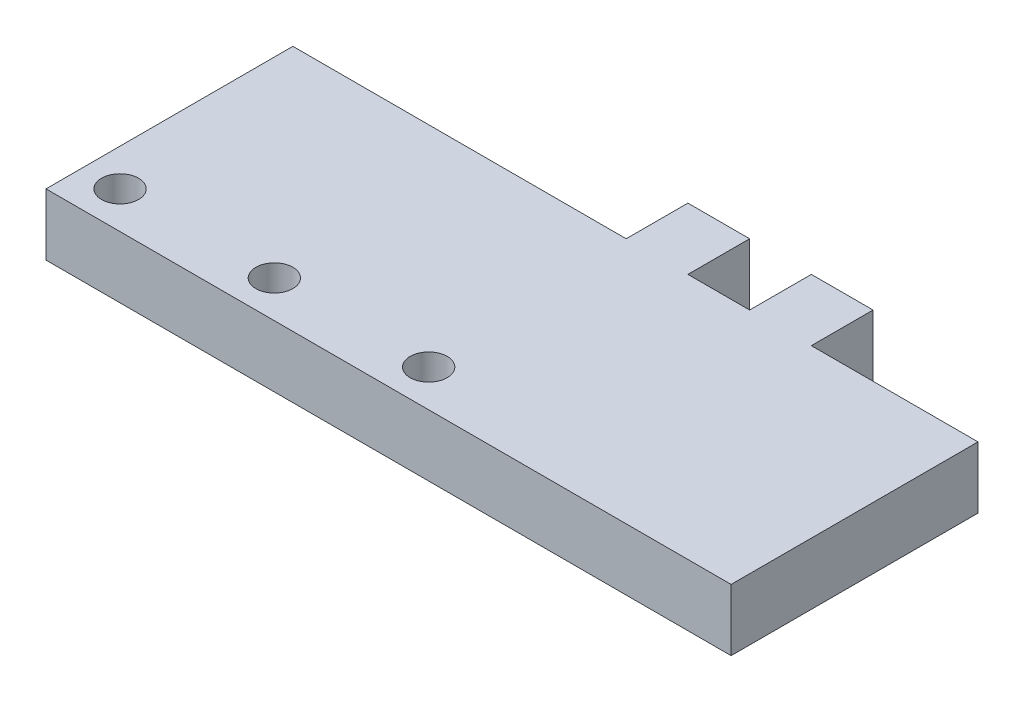
ISO-10303-21;
HEADER;
FILE_DESCRIPTION(('STEP AP214'),'2;1');
FILE_NAME('part.step','',(''),(''),'','','');
FILE_SCHEMA(('AUTOMOTIVE_DESIGN { 1 0 10303 214 1 1 1 1 }'));
ENDSEC;
DATA;
#1=APPLICATION_CONTEXT('core data for automotive mechanical design processes');
#2=APPLICATION_PROTOCOL_DEFINITION('international standard','automotive_design',2000,#1);
#3=PRODUCT_CONTEXT('',#1,'mechanical');
#4=PRODUCT('Part','Part','',(#3));
#5=PRODUCT_RELATED_PRODUCT_CATEGORY('part','',(#4));
#6=PRODUCT_DEFINITION_FORMATION('','',#4);
#7=PRODUCT_DEFINITION_CONTEXT('part definition',#1,'design');
#8=PRODUCT_DEFINITION('design','',#6,#7);
#9=PRODUCT_DEFINITION_SHAPE('','',#8);
#10=(LENGTH_UNIT() NAMED_UNIT(*) SI_UNIT(.MILLI.,.METRE.));
#11=(NAMED_UNIT(*) PLANE_ANGLE_UNIT() SI_UNIT($,.RADIAN.));
#12=(NAMED_UNIT(*) SI_UNIT($,.STERADIAN.) SOLID_ANGLE_UNIT());
#13=UNCERTAINTY_MEASURE_WITH_UNIT(LENGTH_MEASURE(1.E-05),#10,'distance_accuracy_value','');
#14=(GEOMETRIC_REPRESENTATION_CONTEXT(3) GLOBAL_UNCERTAINTY_ASSIGNED_CONTEXT((#13)) GLOBAL_UNIT_ASSIGNED_CONTEXT((#10,
#11,#12)) REPRESENTATION_CONTEXT('',''));
#15=CARTESIAN_POINT('',(0.,0.,0.));
#16=DIRECTION('',(0.,0.,1.));
#17=DIRECTION('',(1.,0.,0.));
#18=AXIS2_PLACEMENT_3D('',#15,#16,#17);
#19=CARTESIAN_POINT('',(0.,10.,0.));
#20=DIRECTION('',(0.,-1.,0.));
#21=DIRECTION('',(0.,0.,-1.));
#22=AXIS2_PLACEMENT_3D('',#19,#20,#21);
#23=PLANE('',#22);
#24=DIRECTION('',(0.,0.,1.));
#25=VECTOR('',#24,1.);
#26=CARTESIAN_POINT('',(-40.5155172196386,10.,12.7019805258216));
#27=LINE('',#26,#25);
#28=CARTESIAN_POINT('',(-40.5155172196386,10.,-27.2980194741784));
#29=VERTEX_POINT('',#28);
#30=CARTESIAN_POINT('',(-40.5155172196386,10.,12.7019805258216));
#31=VERTEX_POINT('',#30);
#32=EDGE_CURVE('E195',#29,#31,#27,.T.);
#33=ORIENTED_EDGE('',*,*,#32,.T.);
#34=DIRECTION('',(1.,0.,0.));
#35=VECTOR('',#34,1.);
#36=CARTESIAN_POINT('',(-40.5155172196386,10.,12.7019805258216));
#37=LINE('',#36,#35);
#38=CARTESIAN_POINT('',(70.4844827803613,10.,12.7019805258216));
#39=VERTEX_POINT('',#38);
#40=EDGE_CURVE('E122',#31,#39,#37,.T.);
#41=ORIENTED_EDGE('',*,*,#40,.T.);
#42=DIRECTION('',(0.,0.,-1.));
#43=VECTOR('',#42,1.);
#44=CARTESIAN_POINT('',(70.4844827803613,10.,12.7019805258216));
#45=LINE('',#44,#43);
#46=CARTESIAN_POINT('',(70.4844827803613,10.,-27.2980194741784));
#47=VERTEX_POINT('',#46);
#48=EDGE_CURVE('E222',#39,#47,#45,.T.);
#49=ORIENTED_EDGE('',*,*,#48,.T.);
#50=DIRECTION('',(-1.,0.,0.));
#51=VECTOR('',#50,1.);
#52=CARTESIAN_POINT('',(43.4844827803614,10.,-27.2980194741784));
#53=LINE('',#52,#51);
#54=CARTESIAN_POINT('',(43.4844827803614,10.,-27.2980194741784));
#55=VERTEX_POINT('',#54);
#56=EDGE_CURVE('E241',#47,#55,#53,.T.);
#57=ORIENTED_EDGE('',*,*,#56,.T.);
#58=DIRECTION('',(0.,0.,-1.));
#59=VECTOR('',#58,1.);
#60=CARTESIAN_POINT('',(43.4844827803614,10.,-27.2980194741784));
#61=LINE('',#60,#59);
#62=CARTESIAN_POINT('',(43.4844827803614,10.,-37.2980194741784));
#63=VERTEX_POINT('',#62);
#64=EDGE_CURVE('E238',#55,#63,#61,.T.);
#65=ORIENTED_EDGE('',*,*,#64,.T.);
#66=DIRECTION('',(-1.,0.,0.));
#67=VECTOR('',#66,1.);
#68=CARTESIAN_POINT('',(33.4844827803614,10.,-37.2980194741784));
#69=LINE('',#68,#67);
#70=CARTESIAN_POINT('',(33.4844827803614,10.,-37.2980194741784));
#71=VERTEX_POINT('',#70);
#72=EDGE_CURVE('E240',#63,#71,#69,.T.);
#73=ORIENTED_EDGE('',*,*,#72,.T.);
#74=DIRECTION('',(0.,0.,1.));
#75=VECTOR('',#74,1.);
#76=CARTESIAN_POINT('',(33.4844827803614,10.,-27.2980194741784));
#77=LINE('',#76,#75);
#78=CARTESIAN_POINT('',(33.4844827803614,10.,-27.2980194741784));
#79=VERTEX_POINT('',#78);
#80=EDGE_CURVE('E243',#71,#79,#77,.T.);
#81=ORIENTED_EDGE('',*,*,#80,.T.);
#82=DIRECTION('',(-1.,0.,0.));
#83=VECTOR('',#82,1.);
#84=CARTESIAN_POINT('',(23.4844827803614,10.,-27.2980194741784));
#85=LINE('',#84,#83);
#86=CARTESIAN_POINT('',(23.4844827803614,10.,-27.2980194741784));
#87=VERTEX_POINT('',#86);
#88=EDGE_CURVE('E249',#79,#87,#85,.T.);
#89=ORIENTED_EDGE('',*,*,#88,.T.);
#90=DIRECTION('',(0.,0.,-1.));
#91=VECTOR('',#90,1.);
#92=CARTESIAN_POINT('',(23.4844827803614,10.,-27.2980194741784));
#93=LINE('',#92,#91);
#94=CARTESIAN_POINT('',(23.4844827803614,10.,-37.2980194741784));
#95=VERTEX_POINT('',#94);
#96=EDGE_CURVE('E154',#87,#95,#93,.T.);
#97=ORIENTED_EDGE('',*,*,#96,.T.);
#98=DIRECTION('',(-1.,0.,0.));
#99=VECTOR('',#98,1.);
#100=CARTESIAN_POINT('',(13.4844827803614,10.,-37.2980194741784));
#101=LINE('',#100,#99);
#102=CARTESIAN_POINT('',(13.4844827803614,10.,-37.2980194741784));
#103=VERTEX_POINT('',#102);
#104=EDGE_CURVE('E148',#95,#103,#101,.T.);
#105=ORIENTED_EDGE('',*,*,#104,.T.);
#106=DIRECTION('',(0.,0.,1.));
#107=VECTOR('',#106,1.);
#108=CARTESIAN_POINT('',(13.4844827803614,10.,-27.2980194741784));
#109=LINE('',#108,#107);
#110=CARTESIAN_POINT('',(13.4844827803614,10.,-27.2980194741784));
#111=VERTEX_POINT('',#110);
#112=EDGE_CURVE('E152',#103,#111,#109,.T.);
#113=ORIENTED_EDGE('',*,*,#112,.T.);
#114=DIRECTION('',(-1.,0.,0.));
#115=VECTOR('',#114,1.);
#116=CARTESIAN_POINT('',(-40.5155172196386,10.,-27.2980194741784));
#117=LINE('',#116,#115);
#118=EDGE_CURVE('E66',#111,#29,#117,.T.);
#119=ORIENTED_EDGE('',*,*,#118,.T.);
#120=EDGE_LOOP('',(#33,#41,#49,#57,#65,#73,#81,#89,#97,#105,#113,#119));
#121=FACE_BOUND('',#120,.T.);
#122=CARTESIAN_POINT('',(-34.5155172196386,10.,6.70198052582159));
#123=DIRECTION('',(0.,1.,0.));
#124=DIRECTION('',(0.,0.,1.));
#125=AXIS2_PLACEMENT_3D('',#122,#123,#124);
#126=CIRCLE('',#125,3.);
#127=CARTESIAN_POINT('',(-34.5155172196386,10.,9.70198052582159));
#128=VERTEX_POINT('',#127);
#129=EDGE_CURVE('E176',#128,#128,#126,.T.);
#130=ORIENTED_EDGE('',*,*,#129,.F.);
#131=EDGE_LOOP('',(#130));
#132=FACE_BOUND('',#131,.T.);
#133=CARTESIAN_POINT('',(-9.51551721963864,10.,6.70198052582159));
#134=DIRECTION('',(0.,1.,0.));
#135=DIRECTION('',(0.,0.,1.));
#136=AXIS2_PLACEMENT_3D('',#133,#134,#135);
#137=CIRCLE('',#136,3.);
#138=CARTESIAN_POINT('',(-9.51551721963864,10.,9.70198052582159));
#139=VERTEX_POINT('',#138);
#140=EDGE_CURVE('E317',#139,#139,#137,.T.);
#141=ORIENTED_EDGE('',*,*,#140,.F.);
#142=EDGE_LOOP('',(#141));
#143=FACE_BOUND('',#142,.T.);
#144=CARTESIAN_POINT('',(15.4844827803614,10.,6.70198052582159));
#145=DIRECTION('',(0.,1.,0.));
#146=DIRECTION('',(0.,0.,1.));
#147=AXIS2_PLACEMENT_3D('',#144,#145,#146);
#148=CIRCLE('',#147,3.);
#149=CARTESIAN_POINT('',(15.4844827803614,10.,9.70198052582159));
#150=VERTEX_POINT('',#149);
#151=EDGE_CURVE('E311',#150,#150,#148,.T.);
#152=ORIENTED_EDGE('',*,*,#151,.F.);
#153=EDGE_LOOP('',(#152));
#154=FACE_BOUND('',#153,.T.);
#155=ADVANCED_FACE('F49',(#121,#132,#143,#154),#23,.F.);
#156=CARTESIAN_POINT('',(0.,0.,0.));
#157=DIRECTION('',(0.,-1.,0.));
#158=DIRECTION('',(0.,0.,-1.));
#159=AXIS2_PLACEMENT_3D('',#156,#157,#158);
#160=PLANE('',#159);
#161=CARTESIAN_POINT('',(-9.51551721963864,0.,6.70198052582159));
#162=DIRECTION('',(0.,1.,0.));
#163=DIRECTION('',(0.,0.,1.));
#164=AXIS2_PLACEMENT_3D('',#161,#162,#163);
#165=CIRCLE('',#164,3.);
#166=CARTESIAN_POINT('',(-9.51551721963864,0.,9.70198052582159));
#167=VERTEX_POINT('',#166);
#168=EDGE_CURVE('E314',#167,#167,#165,.T.);
#169=ORIENTED_EDGE('',*,*,#168,.T.);
#170=EDGE_LOOP('',(#169));
#171=FACE_BOUND('',#170,.T.);
#172=DIRECTION('',(0.,0.,1.));
#173=VECTOR('',#172,1.);
#174=CARTESIAN_POINT('',(-40.5155172196386,0.,12.7019805258216));
#175=LINE('',#174,#173);
#176=CARTESIAN_POINT('',(-40.5155172196386,0.,-27.2980194741784));
#177=VERTEX_POINT('',#176);
#178=CARTESIAN_POINT('',(-40.5155172196386,0.,12.7019805258216));
#179=VERTEX_POINT('',#178);
#180=EDGE_CURVE('E172',#177,#179,#175,.T.);
#181=ORIENTED_EDGE('',*,*,#180,.F.);
#182=DIRECTION('',(-1.,0.,0.));
#183=VECTOR('',#182,1.);
#184=CARTESIAN_POINT('',(-40.5155172196386,0.,-27.2980194741784));
#185=LINE('',#184,#183);
#186=CARTESIAN_POINT('',(13.4844827803614,0.,-27.2980194741784));
#187=VERTEX_POINT('',#186);
#188=EDGE_CURVE('E114',#187,#177,#185,.T.);
#189=ORIENTED_EDGE('',*,*,#188,.F.);
#190=DIRECTION('',(0.,0.,1.));
#191=VECTOR('',#190,1.);
#192=CARTESIAN_POINT('',(13.4844827803614,0.,-27.2980194741784));
#193=LINE('',#192,#191);
#194=CARTESIAN_POINT('',(13.4844827803614,0.,-37.2980194741784));
#195=VERTEX_POINT('',#194);
#196=EDGE_CURVE('E108',#195,#187,#193,.T.);
#197=ORIENTED_EDGE('',*,*,#196,.F.);
#198=DIRECTION('',(-1.,0.,0.));
#199=VECTOR('',#198,1.);
#200=CARTESIAN_POINT('',(13.4844827803614,0.,-37.2980194741784));
#201=LINE('',#200,#199);
#202=CARTESIAN_POINT('',(23.4844827803614,0.,-37.2980194741784));
#203=VERTEX_POINT('',#202);
#204=EDGE_CURVE('E162',#203,#195,#201,.T.);
#205=ORIENTED_EDGE('',*,*,#204,.F.);
#206=DIRECTION('',(0.,0.,-1.));
#207=VECTOR('',#206,1.);
#208=CARTESIAN_POINT('',(23.4844827803614,0.,-27.2980194741784));
#209=LINE('',#208,#207);
#210=CARTESIAN_POINT('',(23.4844827803614,0.,-27.2980194741784));
#211=VERTEX_POINT('',#210);
#212=EDGE_CURVE('E190',#211,#203,#209,.T.);
#213=ORIENTED_EDGE('',*,*,#212,.F.);
#214=DIRECTION('',(-1.,0.,0.));
#215=VECTOR('',#214,1.);
#216=CARTESIAN_POINT('',(23.4844827803614,0.,-27.2980194741784));
#217=LINE('',#216,#215);
#218=CARTESIAN_POINT('',(33.4844827803614,0.,-27.2980194741784));
#219=VERTEX_POINT('',#218);
#220=EDGE_CURVE('E188',#219,#211,#217,.T.);
#221=ORIENTED_EDGE('',*,*,#220,.F.);
#222=DIRECTION('',(0.,0.,1.));
#223=VECTOR('',#222,1.);
#224=CARTESIAN_POINT('',(33.4844827803614,0.,-27.2980194741784));
#225=LINE('',#224,#223);
#226=CARTESIAN_POINT('',(33.4844827803614,0.,-37.2980194741784));
#227=VERTEX_POINT('',#226);
#228=EDGE_CURVE('E186',#227,#219,#225,.T.);
#229=ORIENTED_EDGE('',*,*,#228,.F.);
#230=DIRECTION('',(-1.,0.,0.));
#231=VECTOR('',#230,1.);
#232=CARTESIAN_POINT('',(33.4844827803614,0.,-37.2980194741784));
#233=LINE('',#232,#231);
#234=CARTESIAN_POINT('',(43.4844827803614,0.,-37.2980194741784));
#235=VERTEX_POINT('',#234);
#236=EDGE_CURVE('E184',#235,#227,#233,.T.);
#237=ORIENTED_EDGE('',*,*,#236,.F.);
#238=DIRECTION('',(0.,0.,-1.));
#239=VECTOR('',#238,1.);
#240=CARTESIAN_POINT('',(43.4844827803614,0.,-27.2980194741784));
#241=LINE('',#240,#239);
#242=CARTESIAN_POINT('',(43.4844827803614,0.,-27.2980194741784));
#243=VERTEX_POINT('',#242);
#244=EDGE_CURVE('E182',#243,#235,#241,.T.);
#245=ORIENTED_EDGE('',*,*,#244,.F.);
#246=DIRECTION('',(-1.,0.,0.));
#247=VECTOR('',#246,1.);
#248=CARTESIAN_POINT('',(43.4844827803614,0.,-27.2980194741784));
#249=LINE('',#248,#247);
#250=CARTESIAN_POINT('',(70.4844827803613,0.,-27.2980194741784));
#251=VERTEX_POINT('',#250);
#252=EDGE_CURVE('E180',#251,#243,#249,.T.);
#253=ORIENTED_EDGE('',*,*,#252,.F.);
#254=DIRECTION('',(0.,0.,-1.));
#255=VECTOR('',#254,1.);
#256=CARTESIAN_POINT('',(70.4844827803613,0.,12.7019805258216));
#257=LINE('',#256,#255);
#258=CARTESIAN_POINT('',(70.4844827803613,0.,12.7019805258216));
#259=VERTEX_POINT('',#258);
#260=EDGE_CURVE('E178',#259,#251,#257,.T.);
#261=ORIENTED_EDGE('',*,*,#260,.F.);
#262=DIRECTION('',(1.,0.,0.));
#263=VECTOR('',#262,1.);
#264=CARTESIAN_POINT('',(-40.5155172196386,0.,12.7019805258216));
#265=LINE('',#264,#263);
#266=EDGE_CURVE('E175',#179,#259,#265,.T.);
#267=ORIENTED_EDGE('',*,*,#266,.F.);
#268=EDGE_LOOP('',(#181,#189,#197,#205,#213,#221,#229,#237,#245,#253,#261,#267));
#269=FACE_BOUND('',#268,.T.);
#270=CARTESIAN_POINT('',(-34.5155172196386,0.,6.70198052582159));
#271=DIRECTION('',(0.,1.,0.));
#272=DIRECTION('',(0.,0.,1.));
#273=AXIS2_PLACEMENT_3D('',#270,#271,#272);
#274=CIRCLE('',#273,3.);
#275=CARTESIAN_POINT('',(-34.5155172196386,0.,9.70198052582159));
#276=VERTEX_POINT('',#275);
#277=EDGE_CURVE('E320',#276,#276,#274,.T.);
#278=ORIENTED_EDGE('',*,*,#277,.T.);
#279=EDGE_LOOP('',(#278));
#280=FACE_BOUND('',#279,.T.);
#281=CARTESIAN_POINT('',(15.4844827803614,0.,6.70198052582159));
#282=DIRECTION('',(0.,1.,0.));
#283=DIRECTION('',(0.,0.,1.));
#284=AXIS2_PLACEMENT_3D('',#281,#282,#283);
#285=CIRCLE('',#284,3.);
#286=CARTESIAN_POINT('',(15.4844827803614,0.,9.70198052582159));
#287=VERTEX_POINT('',#286);
#288=EDGE_CURVE('E308',#287,#287,#285,.T.);
#289=ORIENTED_EDGE('',*,*,#288,.T.);
#290=EDGE_LOOP('',(#289));
#291=FACE_BOUND('',#290,.T.);
#292=ADVANCED_FACE('F226',(#171,#269,#280,#291),#160,.T.);
#293=CARTESIAN_POINT('',(-40.5155172196386,10.,12.7019805258216));
#294=DIRECTION('',(1.,0.,0.));
#295=DIRECTION('',(0.,0.,-1.));
#296=AXIS2_PLACEMENT_3D('',#293,#294,#295);
#297=PLANE('',#296);
#298=ORIENTED_EDGE('',*,*,#180,.T.);
#299=DIRECTION('',(0.,-1.,0.));
#300=VECTOR('',#299,1.);
#301=CARTESIAN_POINT('',(-40.5155172196386,10.,12.7019805258216));
#302=LINE('',#301,#300);
#303=EDGE_CURVE('E13',#31,#179,#302,.T.);
#304=ORIENTED_EDGE('',*,*,#303,.F.);
#305=ORIENTED_EDGE('',*,*,#32,.F.);
#306=DIRECTION('',(0.,-1.,0.));
#307=VECTOR('',#306,1.);
#308=CARTESIAN_POINT('',(-40.5155172196386,10.,-27.2980194741784));
#309=LINE('',#308,#307);
#310=EDGE_CURVE('E168',#29,#177,#309,.T.);
#311=ORIENTED_EDGE('',*,*,#310,.T.);
#312=EDGE_LOOP('',(#298,#304,#305,#311));
#313=FACE_BOUND('',#312,.T.);
#314=ADVANCED_FACE('F51',(#313),#297,.F.);
#315=CARTESIAN_POINT('',(-40.5155172196386,10.,12.7019805258216));
#316=DIRECTION('',(0.,0.,-1.));
#317=DIRECTION('',(-1.,0.,0.));
#318=AXIS2_PLACEMENT_3D('',#315,#316,#317);
#319=PLANE('',#318);
#320=ORIENTED_EDGE('',*,*,#266,.T.);
#321=DIRECTION('',(0.,-1.,0.));
#322=VECTOR('',#321,1.);
#323=CARTESIAN_POINT('',(70.4844827803613,10.,12.7019805258216));
#324=LINE('',#323,#322);
#325=EDGE_CURVE('E58',#39,#259,#324,.T.);
#326=ORIENTED_EDGE('',*,*,#325,.F.);
#327=ORIENTED_EDGE('',*,*,#40,.F.);
#328=ORIENTED_EDGE('',*,*,#303,.T.);
#329=EDGE_LOOP('',(#320,#326,#327,#328));
#330=FACE_BOUND('',#329,.T.);
#331=ADVANCED_FACE('F362',(#330),#319,.F.);
#332=CARTESIAN_POINT('',(70.4844827803613,10.,12.7019805258216));
#333=DIRECTION('',(-1.,0.,0.));
#334=DIRECTION('',(0.,0.,1.));
#335=AXIS2_PLACEMENT_3D('',#332,#333,#334);
#336=PLANE('',#335);
#337=ORIENTED_EDGE('',*,*,#260,.T.);
#338=DIRECTION('',(0.,-1.,0.));
#339=VECTOR('',#338,1.);
#340=CARTESIAN_POINT('',(70.4844827803613,10.,-27.2980194741784));
#341=LINE('',#340,#339);
#342=EDGE_CURVE('E214',#47,#251,#341,.T.);
#343=ORIENTED_EDGE('',*,*,#342,.F.);
#344=ORIENTED_EDGE('',*,*,#48,.F.);
#345=ORIENTED_EDGE('',*,*,#325,.T.);
#346=EDGE_LOOP('',(#337,#343,#344,#345));
#347=FACE_BOUND('',#346,.T.);
#348=ADVANCED_FACE('F220',(#347),#336,.F.);
#349=CARTESIAN_POINT('',(43.4844827803614,10.,-27.2980194741784));
#350=DIRECTION('',(0.,0.,1.));
#351=DIRECTION('',(1.,0.,0.));
#352=AXIS2_PLACEMENT_3D('',#349,#350,#351);
#353=PLANE('',#352);
#354=ORIENTED_EDGE('',*,*,#252,.T.);
#355=DIRECTION('',(0.,-1.,0.));
#356=VECTOR('',#355,1.);
#357=CARTESIAN_POINT('',(43.4844827803614,10.,-27.2980194741784));
#358=LINE('',#357,#356);
#359=EDGE_CURVE('E211',#55,#243,#358,.T.);
#360=ORIENTED_EDGE('',*,*,#359,.F.);
#361=ORIENTED_EDGE('',*,*,#56,.F.);
#362=ORIENTED_EDGE('',*,*,#342,.T.);
#363=EDGE_LOOP('',(#354,#360,#361,#362));
#364=FACE_BOUND('',#363,.T.);
#365=ADVANCED_FACE('F232',(#364),#353,.F.);
#366=CARTESIAN_POINT('',(43.4844827803614,10.,-27.2980194741784));
#367=DIRECTION('',(-1.,0.,0.));
#368=DIRECTION('',(0.,0.,1.));
#369=AXIS2_PLACEMENT_3D('',#366,#367,#368);
#370=PLANE('',#369);
#371=ORIENTED_EDGE('',*,*,#244,.T.);
#372=DIRECTION('',(0.,-1.,0.));
#373=VECTOR('',#372,1.);
#374=CARTESIAN_POINT('',(43.4844827803614,10.,-37.2980194741784));
#375=LINE('',#374,#373);
#376=EDGE_CURVE('E208',#63,#235,#375,.T.);
#377=ORIENTED_EDGE('',*,*,#376,.F.);
#378=ORIENTED_EDGE('',*,*,#64,.F.);
#379=ORIENTED_EDGE('',*,*,#359,.T.);
#380=EDGE_LOOP('',(#371,#377,#378,#379));
#381=FACE_BOUND('',#380,.T.);
#382=ADVANCED_FACE('F236',(#381),#370,.F.);
#383=CARTESIAN_POINT('',(33.4844827803614,10.,-37.2980194741784));
#384=DIRECTION('',(0.,0.,1.));
#385=DIRECTION('',(1.,0.,0.));
#386=AXIS2_PLACEMENT_3D('',#383,#384,#385);
#387=PLANE('',#386);
#388=ORIENTED_EDGE('',*,*,#236,.T.);
#389=DIRECTION('',(0.,-1.,0.));
#390=VECTOR('',#389,1.);
#391=CARTESIAN_POINT('',(33.4844827803614,10.,-37.2980194741784));
#392=LINE('',#391,#390);
#393=EDGE_CURVE('E205',#71,#227,#392,.T.);
#394=ORIENTED_EDGE('',*,*,#393,.F.);
#395=ORIENTED_EDGE('',*,*,#72,.F.);
#396=ORIENTED_EDGE('',*,*,#376,.T.);
#397=EDGE_LOOP('',(#388,#394,#395,#396));
#398=FACE_BOUND('',#397,.T.);
#399=ADVANCED_FACE('F349',(#398),#387,.F.);
#400=CARTESIAN_POINT('',(33.4844827803614,10.,-27.2980194741784));
#401=DIRECTION('',(1.,0.,0.));
#402=DIRECTION('',(0.,0.,-1.));
#403=AXIS2_PLACEMENT_3D('',#400,#401,#402);
#404=PLANE('',#403);
#405=ORIENTED_EDGE('',*,*,#228,.T.);
#406=DIRECTION('',(0.,-1.,0.));
#407=VECTOR('',#406,1.);
#408=CARTESIAN_POINT('',(33.4844827803614,10.,-27.2980194741784));
#409=LINE('',#408,#407);
#410=EDGE_CURVE('E202',#79,#219,#409,.T.);
#411=ORIENTED_EDGE('',*,*,#410,.F.);
#412=ORIENTED_EDGE('',*,*,#80,.F.);
#413=ORIENTED_EDGE('',*,*,#393,.T.);
#414=EDGE_LOOP('',(#405,#411,#412,#413));
#415=FACE_BOUND('',#414,.T.);
#416=ADVANCED_FACE('F342',(#415),#404,.F.);
#417=CARTESIAN_POINT('',(23.4844827803614,10.,-27.2980194741784));
#418=DIRECTION('',(0.,0.,1.));
#419=DIRECTION('',(1.,0.,0.));
#420=AXIS2_PLACEMENT_3D('',#417,#418,#419);
#421=PLANE('',#420);
#422=CARTESIAN_POINT('',(28.4844827803614,5.,-27.2980194741784));
#423=DIRECTION('',(0.,0.,-1.));
#424=DIRECTION('',(-1.,0.,0.));
#425=AXIS2_PLACEMENT_3D('',#422,#423,#424);
#426=CIRCLE('',#425,1.24999999999999);
#427=CARTESIAN_POINT('',(27.2344827803614,5.,-27.2980194741784));
#428=VERTEX_POINT('',#427);
#429=EDGE_CURVE('E305',#428,#428,#426,.T.);
#430=ORIENTED_EDGE('',*,*,#429,.F.);
#431=EDGE_LOOP('',(#430));
#432=FACE_BOUND('',#431,.T.);
#433=ORIENTED_EDGE('',*,*,#220,.T.);
#434=DIRECTION('',(0.,-1.,0.));
#435=VECTOR('',#434,1.);
#436=CARTESIAN_POINT('',(23.4844827803614,10.,-27.2980194741784));
#437=LINE('',#436,#435);
#438=EDGE_CURVE('E199',#87,#211,#437,.T.);
#439=ORIENTED_EDGE('',*,*,#438,.F.);
#440=ORIENTED_EDGE('',*,*,#88,.F.);
#441=ORIENTED_EDGE('',*,*,#410,.T.);
#442=EDGE_LOOP('',(#433,#439,#440,#441));
#443=FACE_BOUND('',#442,.T.);
#444=ADVANCED_FACE('F255',(#432,#443),#421,.F.);
#445=CARTESIAN_POINT('',(23.4844827803614,10.,-27.2980194741784));
#446=DIRECTION('',(-1.,0.,0.));
#447=DIRECTION('',(0.,0.,1.));
#448=AXIS2_PLACEMENT_3D('',#445,#446,#447);
#449=PLANE('',#448);
#450=ORIENTED_EDGE('',*,*,#212,.T.);
#451=DIRECTION('',(0.,-1.,0.));
#452=VECTOR('',#451,1.);
#453=CARTESIAN_POINT('',(23.4844827803614,10.,-37.2980194741784));
#454=LINE('',#453,#452);
#455=EDGE_CURVE('E163',#95,#203,#454,.T.);
#456=ORIENTED_EDGE('',*,*,#455,.F.);
#457=ORIENTED_EDGE('',*,*,#96,.F.);
#458=ORIENTED_EDGE('',*,*,#438,.T.);
#459=EDGE_LOOP('',(#450,#456,#457,#458));
#460=FACE_BOUND('',#459,.T.);
#461=ADVANCED_FACE('F259',(#460),#449,.F.);
#462=CARTESIAN_POINT('',(13.4844827803614,10.,-37.2980194741784));
#463=DIRECTION('',(0.,0.,1.));
#464=DIRECTION('',(1.,0.,0.));
#465=AXIS2_PLACEMENT_3D('',#462,#463,#464);
#466=PLANE('',#465);
#467=ORIENTED_EDGE('',*,*,#204,.T.);
#468=DIRECTION('',(0.,-1.,0.));
#469=VECTOR('',#468,1.);
#470=CARTESIAN_POINT('',(13.4844827803614,10.,-37.2980194741784));
#471=LINE('',#470,#469);
#472=EDGE_CURVE('E159',#103,#195,#471,.T.);
#473=ORIENTED_EDGE('',*,*,#472,.F.);
#474=ORIENTED_EDGE('',*,*,#104,.F.);
#475=ORIENTED_EDGE('',*,*,#455,.T.);
#476=EDGE_LOOP('',(#467,#473,#474,#475));
#477=FACE_BOUND('',#476,.T.);
#478=ADVANCED_FACE('F160',(#477),#466,.F.);
#479=CARTESIAN_POINT('',(13.4844827803614,10.,-27.2980194741784));
#480=DIRECTION('',(1.,0.,0.));
#481=DIRECTION('',(0.,0.,-1.));
#482=AXIS2_PLACEMENT_3D('',#479,#480,#481);
#483=PLANE('',#482);
#484=ORIENTED_EDGE('',*,*,#196,.T.);
#485=DIRECTION('',(0.,-1.,0.));
#486=VECTOR('',#485,1.);
#487=CARTESIAN_POINT('',(13.4844827803614,10.,-27.2980194741784));
#488=LINE('',#487,#486);
#489=EDGE_CURVE('E164',#111,#187,#488,.T.);
#490=ORIENTED_EDGE('',*,*,#489,.F.);
#491=ORIENTED_EDGE('',*,*,#112,.F.);
#492=ORIENTED_EDGE('',*,*,#472,.T.);
#493=EDGE_LOOP('',(#484,#490,#491,#492));
#494=FACE_BOUND('',#493,.T.);
#495=ADVANCED_FACE('F166',(#494),#483,.F.);
#496=CARTESIAN_POINT('',(-40.5155172196386,10.,-27.2980194741784));
#497=DIRECTION('',(0.,0.,1.));
#498=DIRECTION('',(1.,0.,0.));
#499=AXIS2_PLACEMENT_3D('',#496,#497,#498);
#500=PLANE('',#499);
#501=ORIENTED_EDGE('',*,*,#188,.T.);
#502=ORIENTED_EDGE('',*,*,#310,.F.);
#503=ORIENTED_EDGE('',*,*,#118,.F.);
#504=ORIENTED_EDGE('',*,*,#489,.T.);
#505=EDGE_LOOP('',(#501,#502,#503,#504));
#506=FACE_BOUND('',#505,.T.);
#507=ADVANCED_FACE('F263',(#506),#500,.F.);
#508=CARTESIAN_POINT('',(-34.5155172196386,10.,6.70198052582159));
#509=DIRECTION('',(0.,-1.,0.));
#510=DIRECTION('',(0.,0.,-1.));
#511=AXIS2_PLACEMENT_3D('',#508,#509,#510);
#512=CYLINDRICAL_SURFACE('',#511,3.);
#513=ORIENTED_EDGE('',*,*,#129,.T.);
#514=EDGE_LOOP('',(#513));
#515=FACE_BOUND('',#514,.T.);
#516=ORIENTED_EDGE('',*,*,#277,.F.);
#517=EDGE_LOOP('',(#516));
#518=FACE_BOUND('',#517,.T.);
#519=ADVANCED_FACE('F265',(#515,#518),#512,.F.);
#520=CARTESIAN_POINT('',(-9.51551721963864,10.,6.70198052582159));
#521=DIRECTION('',(0.,-1.,0.));
#522=DIRECTION('',(0.,0.,-1.));
#523=AXIS2_PLACEMENT_3D('',#520,#521,#522);
#524=CYLINDRICAL_SURFACE('',#523,3.);
#525=ORIENTED_EDGE('',*,*,#140,.T.);
#526=EDGE_LOOP('',(#525));
#527=FACE_BOUND('',#526,.T.);
#528=ORIENTED_EDGE('',*,*,#168,.F.);
#529=EDGE_LOOP('',(#528));
#530=FACE_BOUND('',#529,.T.);
#531=ADVANCED_FACE('F271',(#527,#530),#524,.F.);
#532=CARTESIAN_POINT('',(15.4844827803614,10.,6.70198052582159));
#533=DIRECTION('',(0.,-1.,0.));
#534=DIRECTION('',(0.,0.,-1.));
#535=AXIS2_PLACEMENT_3D('',#532,#533,#534);
#536=CYLINDRICAL_SURFACE('',#535,3.);
#537=ORIENTED_EDGE('',*,*,#151,.T.);
#538=EDGE_LOOP('',(#537));
#539=FACE_BOUND('',#538,.T.);
#540=ORIENTED_EDGE('',*,*,#288,.F.);
#541=EDGE_LOOP('',(#540));
#542=FACE_BOUND('',#541,.T.);
#543=ADVANCED_FACE('F285',(#539,#542),#536,.F.);
#544=CARTESIAN_POINT('',(28.4844827803614,5.,-22.2980194741784));
#545=DIRECTION('',(0.,0.,-1.));
#546=DIRECTION('',(-1.,0.,0.));
#547=AXIS2_PLACEMENT_3D('',#544,#545,#546);
#548=CONICAL_SURFACE('',#547,1.25,1.02974425867665);
#549=CARTESIAN_POINT('',(28.4844827803614,5.,-21.546943700394));
#550=VERTEX_POINT('',#549);
#551=VERTEX_LOOP('',#550);
#552=FACE_BOUND('',#551,.T.);
#553=CARTESIAN_POINT('',(28.4844827803614,5.,-22.2980194741784));
#554=DIRECTION('',(0.,0.,-1.));
#555=DIRECTION('',(-1.,0.,0.));
#556=AXIS2_PLACEMENT_3D('',#553,#554,#555);
#557=CIRCLE('',#556,1.25);
#558=CARTESIAN_POINT('',(27.2344827803614,5.,-22.2980194741784));
#559=VERTEX_POINT('',#558);
#560=EDGE_CURVE('E302',#559,#559,#557,.T.);
#561=ORIENTED_EDGE('',*,*,#560,.T.);
#562=EDGE_LOOP('',(#561));
#563=FACE_BOUND('',#562,.T.);
#564=ADVANCED_FACE('F289',(#552,#563),#548,.F.);
#565=CARTESIAN_POINT('',(28.4844827803614,5.,-27.2980194741784));
#566=DIRECTION('',(0.,0.,-1.));
#567=DIRECTION('',(-1.,0.,0.));
#568=AXIS2_PLACEMENT_3D('',#565,#566,#567);
#569=CYLINDRICAL_SURFACE('',#568,1.24999999999999);
#570=ORIENTED_EDGE('',*,*,#560,.F.);
#571=EDGE_LOOP('',(#570));
#572=FACE_BOUND('',#571,.T.);
#573=ORIENTED_EDGE('',*,*,#429,.T.);
#574=EDGE_LOOP('',(#573));
#575=FACE_BOUND('',#574,.T.);
#576=ADVANCED_FACE('F293',(#572,#575),#569,.F.);
#577=CLOSED_SHELL('',(#155,#292,#314,#331,#348,#365,#382,#399,#416,#444,#461,#478,#495,#507,
#519,#531,#543,#564,#576));
#578=MANIFOLD_SOLID_BREP('B2',#577);
#579=ADVANCED_BREP_SHAPE_REPRESENTATION('',(#18,#578),#14);
#580=SHAPE_DEFINITION_REPRESENTATION(#9,#579);
ENDSEC;
END-ISO-10303-21;
